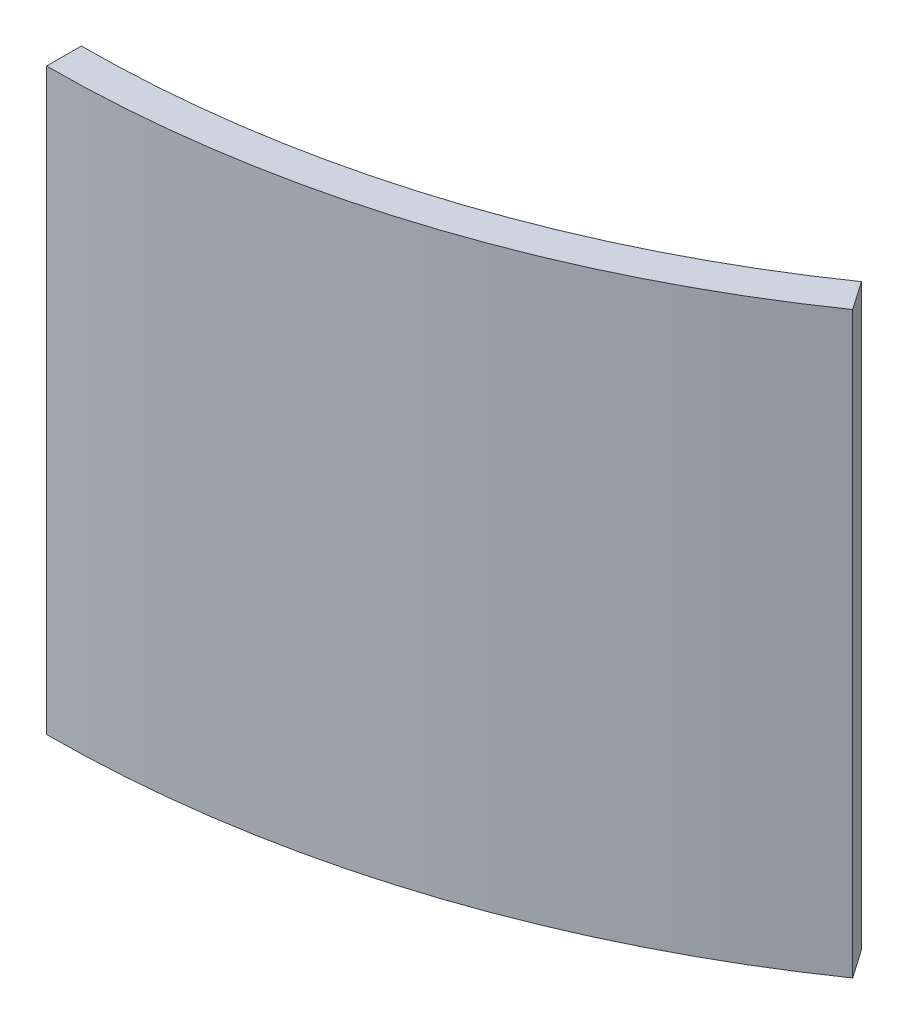
ISO-10303-21;
HEADER;
FILE_DESCRIPTION(('STEP AP214'),'2;1');
FILE_NAME('part.step','',(''),(''),'','','');
FILE_SCHEMA(('AUTOMOTIVE_DESIGN { 1 0 10303 214 1 1 1 1 }'));
ENDSEC;
DATA;
#1=APPLICATION_CONTEXT('core data for automotive mechanical design processes');
#2=APPLICATION_PROTOCOL_DEFINITION('international standard','automotive_design',2000,#1);
#3=PRODUCT_CONTEXT('',#1,'mechanical');
#4=PRODUCT('Part','Part','',(#3));
#5=PRODUCT_RELATED_PRODUCT_CATEGORY('part','',(#4));
#6=PRODUCT_DEFINITION_FORMATION('','',#4);
#7=PRODUCT_DEFINITION_CONTEXT('part definition',#1,'design');
#8=PRODUCT_DEFINITION('design','',#6,#7);
#9=PRODUCT_DEFINITION_SHAPE('','',#8);
#10=(LENGTH_UNIT() NAMED_UNIT(*) SI_UNIT(.MILLI.,.METRE.));
#11=(NAMED_UNIT(*) PLANE_ANGLE_UNIT() SI_UNIT($,.RADIAN.));
#12=(NAMED_UNIT(*) SI_UNIT($,.STERADIAN.) SOLID_ANGLE_UNIT());
#13=UNCERTAINTY_MEASURE_WITH_UNIT(LENGTH_MEASURE(1.E-05),#10,'distance_accuracy_value','');
#14=(GEOMETRIC_REPRESENTATION_CONTEXT(3) GLOBAL_UNCERTAINTY_ASSIGNED_CONTEXT((#13)) GLOBAL_UNIT_ASSIGNED_CONTEXT((#10,
#11,#12)) REPRESENTATION_CONTEXT('',''));
#15=CARTESIAN_POINT('',(0.,0.,0.));
#16=DIRECTION('',(0.,0.,1.));
#17=DIRECTION('',(1.,0.,0.));
#18=AXIS2_PLACEMENT_3D('',#15,#16,#17);
#19=CARTESIAN_POINT('',(0.,50.,0.));
#20=DIRECTION('',(0.,-1.,0.));
#21=DIRECTION('',(0.,0.,-1.));
#22=AXIS2_PLACEMENT_3D('',#19,#20,#21);
#23=CYLINDRICAL_SURFACE('',#22,90.);
#24=CARTESIAN_POINT('',(0.,0.,0.));
#25=DIRECTION('',(0.,-1.,0.));
#26=DIRECTION('',(0.,0.,1.));
#27=AXIS2_PLACEMENT_3D('',#24,#25,#26);
#28=CIRCLE('',#27,90.);
#29=CARTESIAN_POINT('',(51.3157047779747,0.,73.9371249315237));
#30=VERTEX_POINT('',#29);
#31=CARTESIAN_POINT('',(0.,0.,90.));
#32=VERTEX_POINT('',#31);
#33=EDGE_CURVE('E96',#30,#32,#28,.T.);
#34=ORIENTED_EDGE('',*,*,#33,.T.);
#35=DIRECTION('',(0.,-1.,0.));
#36=VECTOR('',#35,1.);
#37=CARTESIAN_POINT('',(0.,50.,90.));
#38=LINE('',#37,#36);
#39=CARTESIAN_POINT('',(0.,50.,90.));
#40=VERTEX_POINT('',#39);
#41=EDGE_CURVE('E11',#40,#32,#38,.T.);
#42=ORIENTED_EDGE('',*,*,#41,.F.);
#43=CARTESIAN_POINT('',(0.,50.,0.));
#44=DIRECTION('',(0.,-1.,0.));
#45=DIRECTION('',(0.,0.,1.));
#46=AXIS2_PLACEMENT_3D('',#43,#44,#45);
#47=CIRCLE('',#46,90.);
#48=CARTESIAN_POINT('',(51.3157047779747,50.,73.9371249315237));
#49=VERTEX_POINT('',#48);
#50=EDGE_CURVE('E84',#49,#40,#47,.T.);
#51=ORIENTED_EDGE('',*,*,#50,.F.);
#52=DIRECTION('',(0.,-1.,0.));
#53=VECTOR('',#52,1.);
#54=CARTESIAN_POINT('',(51.3157047779747,50.,73.9371249315237));
#55=LINE('',#54,#53);
#56=EDGE_CURVE('E92',#49,#30,#55,.T.);
#57=ORIENTED_EDGE('',*,*,#56,.T.);
#58=EDGE_LOOP('',(#34,#42,#51,#57));
#59=FACE_BOUND('',#58,.T.);
#60=ADVANCED_FACE('F33',(#59),#23,.F.);
#61=CARTESIAN_POINT('',(0.,50.,90.));
#62=DIRECTION('',(1.,0.,0.));
#63=DIRECTION('',(0.,0.,-1.));
#64=AXIS2_PLACEMENT_3D('',#61,#62,#63);
#65=PLANE('',#64);
#66=DIRECTION('',(0.,0.,1.));
#67=VECTOR('',#66,1.);
#68=CARTESIAN_POINT('',(0.,0.,90.));
#69=LINE('',#68,#67);
#70=CARTESIAN_POINT('',(0.,0.,93.));
#71=VERTEX_POINT('',#70);
#72=EDGE_CURVE('E88',#32,#71,#69,.T.);
#73=ORIENTED_EDGE('',*,*,#72,.T.);
#74=DIRECTION('',(0.,-1.,0.));
#75=VECTOR('',#74,1.);
#76=CARTESIAN_POINT('',(0.,50.,93.));
#77=LINE('',#76,#75);
#78=CARTESIAN_POINT('',(0.,50.,93.));
#79=VERTEX_POINT('',#78);
#80=EDGE_CURVE('E41',#79,#71,#77,.T.);
#81=ORIENTED_EDGE('',*,*,#80,.F.);
#82=DIRECTION('',(0.,0.,1.));
#83=VECTOR('',#82,1.);
#84=CARTESIAN_POINT('',(0.,50.,90.));
#85=LINE('',#84,#83);
#86=EDGE_CURVE('E79',#40,#79,#85,.T.);
#87=ORIENTED_EDGE('',*,*,#86,.F.);
#88=ORIENTED_EDGE('',*,*,#41,.T.);
#89=EDGE_LOOP('',(#73,#81,#87,#88));
#90=FACE_BOUND('',#89,.T.);
#91=ADVANCED_FACE('F87',(#90),#65,.F.);
#92=CARTESIAN_POINT('',(0.,50.,0.));
#93=DIRECTION('',(0.,-1.,0.));
#94=DIRECTION('',(0.,0.,-1.));
#95=AXIS2_PLACEMENT_3D('',#92,#93,#94);
#96=CYLINDRICAL_SURFACE('',#95,93.);
#97=CARTESIAN_POINT('',(0.,0.,0.));
#98=DIRECTION('',(0.,1.,0.));
#99=DIRECTION('',(0.,0.,1.));
#100=AXIS2_PLACEMENT_3D('',#97,#98,#99);
#101=CIRCLE('',#100,93.);
#102=CARTESIAN_POINT('',(53.0262282705739,0.,76.4016957625745));
#103=VERTEX_POINT('',#102);
#104=EDGE_CURVE('E66',#71,#103,#101,.T.);
#105=ORIENTED_EDGE('',*,*,#104,.T.);
#106=DIRECTION('',(0.,-1.,0.));
#107=VECTOR('',#106,1.);
#108=CARTESIAN_POINT('',(53.0262282705739,50.,76.4016957625745));
#109=LINE('',#108,#107);
#110=CARTESIAN_POINT('',(53.0262282705739,50.,76.4016957625745));
#111=VERTEX_POINT('',#110);
#112=EDGE_CURVE('E89',#111,#103,#109,.T.);
#113=ORIENTED_EDGE('',*,*,#112,.F.);
#114=CARTESIAN_POINT('',(0.,50.,0.));
#115=DIRECTION('',(0.,1.,0.));
#116=DIRECTION('',(0.,0.,1.));
#117=AXIS2_PLACEMENT_3D('',#114,#115,#116);
#118=CIRCLE('',#117,93.);
#119=EDGE_CURVE('E82',#79,#111,#118,.T.);
#120=ORIENTED_EDGE('',*,*,#119,.F.);
#121=ORIENTED_EDGE('',*,*,#80,.T.);
#122=EDGE_LOOP('',(#105,#113,#120,#121));
#123=FACE_BOUND('',#122,.T.);
#124=ADVANCED_FACE('F90',(#123),#96,.T.);
#125=CARTESIAN_POINT('',(51.3157047779747,50.,73.9371249315237));
#126=DIRECTION('',(-0.821523610350262,0.,0.570174497533054));
#127=DIRECTION('',(0.570174497533054,0.,0.821523610350262));
#128=AXIS2_PLACEMENT_3D('',#125,#126,#127);
#129=PLANE('',#128);
#130=DIRECTION('',(-0.570174497533054,0.,-0.821523610350262));
#131=VECTOR('',#130,1.);
#132=CARTESIAN_POINT('',(51.3157047779747,0.,73.9371249315237));
#133=LINE('',#132,#131);
#134=EDGE_CURVE('E72',#103,#30,#133,.T.);
#135=ORIENTED_EDGE('',*,*,#134,.T.);
#136=ORIENTED_EDGE('',*,*,#56,.F.);
#137=DIRECTION('',(-0.570174497533054,0.,-0.821523610350262));
#138=VECTOR('',#137,1.);
#139=CARTESIAN_POINT('',(51.3157047779747,50.,73.9371249315237));
#140=LINE('',#139,#138);
#141=EDGE_CURVE('E49',#111,#49,#140,.T.);
#142=ORIENTED_EDGE('',*,*,#141,.F.);
#143=ORIENTED_EDGE('',*,*,#112,.T.);
#144=EDGE_LOOP('',(#135,#136,#142,#143));
#145=FACE_BOUND('',#144,.T.);
#146=ADVANCED_FACE('F103',(#145),#129,.F.);
#147=CARTESIAN_POINT('',(0.,50.,0.));
#148=DIRECTION('',(0.,1.,0.));
#149=DIRECTION('',(0.,0.,1.));
#150=AXIS2_PLACEMENT_3D('',#147,#148,#149);
#151=PLANE('',#150);
#152=ORIENTED_EDGE('',*,*,#50,.T.);
#153=ORIENTED_EDGE('',*,*,#86,.T.);
#154=ORIENTED_EDGE('',*,*,#119,.T.);
#155=ORIENTED_EDGE('',*,*,#141,.T.);
#156=EDGE_LOOP('',(#152,#153,#154,#155));
#157=FACE_BOUND('',#156,.T.);
#158=ADVANCED_FACE('F80',(#157),#151,.T.);
#159=CARTESIAN_POINT('',(0.,0.,0.));
#160=DIRECTION('',(0.,1.,0.));
#161=DIRECTION('',(0.,0.,1.));
#162=AXIS2_PLACEMENT_3D('',#159,#160,#161);
#163=PLANE('',#162);
#164=ORIENTED_EDGE('',*,*,#33,.F.);
#165=ORIENTED_EDGE('',*,*,#134,.F.);
#166=ORIENTED_EDGE('',*,*,#104,.F.);
#167=ORIENTED_EDGE('',*,*,#72,.F.);
#168=EDGE_LOOP('',(#164,#165,#166,#167));
#169=FACE_BOUND('',#168,.T.);
#170=ADVANCED_FACE('F106',(#169),#163,.F.);
#171=CLOSED_SHELL('',(#60,#91,#124,#146,#158,#170));
#172=MANIFOLD_SOLID_BREP('B2',#171);
#173=ADVANCED_BREP_SHAPE_REPRESENTATION('',(#18,#172),#14);
#174=SHAPE_DEFINITION_REPRESENTATION(#9,#173);
ENDSEC;
END-ISO-10303-21;
